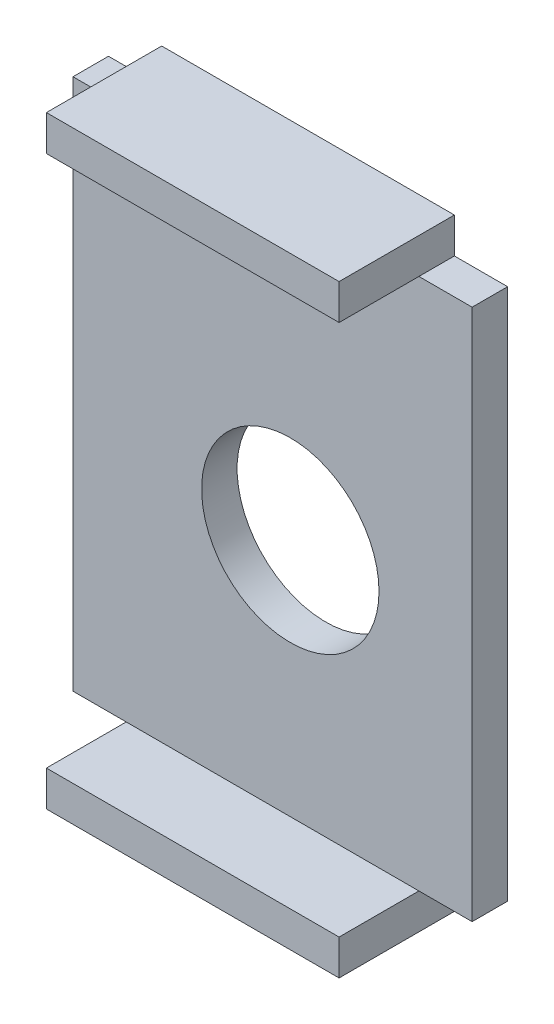
ISO-10303-21;
HEADER;
FILE_DESCRIPTION(('STEP AP214'),'2;1');
FILE_NAME('part.step','',(''),(''),'','','');
FILE_SCHEMA(('AUTOMOTIVE_DESIGN { 1 0 10303 214 1 1 1 1 }'));
ENDSEC;
DATA;
#1=APPLICATION_CONTEXT('core data for automotive mechanical design processes');
#2=APPLICATION_PROTOCOL_DEFINITION('international standard','automotive_design',2000,#1);
#3=PRODUCT_CONTEXT('',#1,'mechanical');
#4=PRODUCT('Part','Part','',(#3));
#5=PRODUCT_RELATED_PRODUCT_CATEGORY('part','',(#4));
#6=PRODUCT_DEFINITION_FORMATION('','',#4);
#7=PRODUCT_DEFINITION_CONTEXT('part definition',#1,'design');
#8=PRODUCT_DEFINITION('design','',#6,#7);
#9=PRODUCT_DEFINITION_SHAPE('','',#8);
#10=(LENGTH_UNIT() NAMED_UNIT(*) SI_UNIT(.MILLI.,.METRE.));
#11=(NAMED_UNIT(*) PLANE_ANGLE_UNIT() SI_UNIT($,.RADIAN.));
#12=(NAMED_UNIT(*) SI_UNIT($,.STERADIAN.) SOLID_ANGLE_UNIT());
#13=UNCERTAINTY_MEASURE_WITH_UNIT(LENGTH_MEASURE(1.E-05),#10,'distance_accuracy_value','');
#14=(GEOMETRIC_REPRESENTATION_CONTEXT(3) GLOBAL_UNCERTAINTY_ASSIGNED_CONTEXT((#13)) GLOBAL_UNIT_ASSIGNED_CONTEXT((#10,
#11,#12)) REPRESENTATION_CONTEXT('',''));
#15=CARTESIAN_POINT('',(0.,0.,0.));
#16=DIRECTION('',(0.,0.,1.));
#17=DIRECTION('',(1.,0.,0.));
#18=AXIS2_PLACEMENT_3D('',#15,#16,#17);
#19=CARTESIAN_POINT('',(-22.5,-30.,2.));
#20=DIRECTION('',(0.,1.,0.));
#21=DIRECTION('',(0.,0.,1.));
#22=AXIS2_PLACEMENT_3D('',#19,#20,#21);
#23=PLANE('',#22);
#24=DIRECTION('',(0.,0.,-1.));
#25=VECTOR('',#24,1.);
#26=CARTESIAN_POINT('',(-16.5,-30.,11.));
#27=LINE('',#26,#25);
#28=CARTESIAN_POINT('',(-16.5,-30.,2.00000000000001));
#29=VERTEX_POINT('',#28);
#30=CARTESIAN_POINT('',(-16.5,-30.,-2.));
#31=VERTEX_POINT('',#30);
#32=EDGE_CURVE('E11',#29,#31,#27,.T.);
#33=ORIENTED_EDGE('',*,*,#32,.F.);
#34=DIRECTION('',(1.,0.,0.));
#35=VECTOR('',#34,1.);
#36=CARTESIAN_POINT('',(-22.5,-30.,2.));
#37=LINE('',#36,#35);
#38=CARTESIAN_POINT('',(-22.5,-30.,2.));
#39=VERTEX_POINT('',#38);
#40=EDGE_CURVE('E221',#39,#29,#37,.T.);
#41=ORIENTED_EDGE('',*,*,#40,.F.);
#42=DIRECTION('',(0.,0.,-1.));
#43=VECTOR('',#42,1.);
#44=CARTESIAN_POINT('',(-22.5,-30.,2.));
#45=LINE('',#44,#43);
#46=CARTESIAN_POINT('',(-22.5,-30.,-2.));
#47=VERTEX_POINT('',#46);
#48=EDGE_CURVE('E239',#39,#47,#45,.T.);
#49=ORIENTED_EDGE('',*,*,#48,.T.);
#50=DIRECTION('',(1.,0.,0.));
#51=VECTOR('',#50,1.);
#52=CARTESIAN_POINT('',(-22.5,-30.,-2.));
#53=LINE('',#52,#51);
#54=EDGE_CURVE('E213',#47,#31,#53,.T.);
#55=ORIENTED_EDGE('',*,*,#54,.T.);
#56=EDGE_LOOP('',(#33,#41,#49,#55));
#57=FACE_BOUND('',#56,.T.);
#58=ADVANCED_FACE('F33',(#57),#23,.F.);
#59=CARTESIAN_POINT('',(-22.5,30.,2.));
#60=DIRECTION('',(0.,-1.,0.));
#61=DIRECTION('',(0.,0.,-1.));
#62=AXIS2_PLACEMENT_3D('',#59,#60,#61);
#63=PLANE('',#62);
#64=DIRECTION('',(0.,0.,-1.));
#65=VECTOR('',#64,1.);
#66=CARTESIAN_POINT('',(16.5,30.,11.));
#67=LINE('',#66,#65);
#68=CARTESIAN_POINT('',(16.5,30.,2.00000000000001));
#69=VERTEX_POINT('',#68);
#70=CARTESIAN_POINT('',(16.5,30.,-2.));
#71=VERTEX_POINT('',#70);
#72=EDGE_CURVE('E202',#69,#71,#67,.T.);
#73=ORIENTED_EDGE('',*,*,#72,.F.);
#74=DIRECTION('',(-1.,0.,0.));
#75=VECTOR('',#74,1.);
#76=CARTESIAN_POINT('',(-22.5,30.,2.));
#77=LINE('',#76,#75);
#78=CARTESIAN_POINT('',(22.5,30.,2.));
#79=VERTEX_POINT('',#78);
#80=EDGE_CURVE('E214',#79,#69,#77,.T.);
#81=ORIENTED_EDGE('',*,*,#80,.F.);
#82=DIRECTION('',(0.,0.,-1.));
#83=VECTOR('',#82,1.);
#84=CARTESIAN_POINT('',(22.5,30.,2.));
#85=LINE('',#84,#83);
#86=CARTESIAN_POINT('',(22.5,30.,-2.));
#87=VERTEX_POINT('',#86);
#88=EDGE_CURVE('E37',#79,#87,#85,.T.);
#89=ORIENTED_EDGE('',*,*,#88,.T.);
#90=DIRECTION('',(-1.,0.,0.));
#91=VECTOR('',#90,1.);
#92=CARTESIAN_POINT('',(-22.5,30.,-2.));
#93=LINE('',#92,#91);
#94=EDGE_CURVE('E229',#87,#71,#93,.T.);
#95=ORIENTED_EDGE('',*,*,#94,.T.);
#96=EDGE_LOOP('',(#73,#81,#89,#95));
#97=FACE_BOUND('',#96,.T.);
#98=ADVANCED_FACE('F285',(#97),#63,.F.);
#99=CARTESIAN_POINT('',(0.,0.,2.));
#100=DIRECTION('',(0.,0.,-1.));
#101=DIRECTION('',(-1.,0.,0.));
#102=AXIS2_PLACEMENT_3D('',#99,#100,#101);
#103=PLANE('',#102);
#104=DIRECTION('',(0.,1.,0.));
#105=VECTOR('',#104,1.);
#106=CARTESIAN_POINT('',(22.5,-30.,2.));
#107=LINE('',#106,#105);
#108=CARTESIAN_POINT('',(22.5,-30.,2.));
#109=VERTEX_POINT('',#108);
#110=EDGE_CURVE('E209',#109,#79,#107,.T.);
#111=ORIENTED_EDGE('',*,*,#110,.T.);
#112=ORIENTED_EDGE('',*,*,#80,.T.);
#113=CARTESIAN_POINT('',(-16.5,30.,2.00000000000001));
#114=VERTEX_POINT('',#113);
#115=EDGE_CURVE('E218',#69,#114,#77,.T.);
#116=ORIENTED_EDGE('',*,*,#115,.T.);
#117=CARTESIAN_POINT('',(-22.5,30.,2.));
#118=VERTEX_POINT('',#117);
#119=EDGE_CURVE('E212',#114,#118,#77,.T.);
#120=ORIENTED_EDGE('',*,*,#119,.T.);
#121=DIRECTION('',(0.,-1.,0.));
#122=VECTOR('',#121,1.);
#123=CARTESIAN_POINT('',(-22.5,-30.,2.));
#124=LINE('',#123,#122);
#125=EDGE_CURVE('E217',#118,#39,#124,.T.);
#126=ORIENTED_EDGE('',*,*,#125,.T.);
#127=ORIENTED_EDGE('',*,*,#40,.T.);
#128=CARTESIAN_POINT('',(16.5,-30.,2.00000000000001));
#129=VERTEX_POINT('',#128);
#130=EDGE_CURVE('E225',#29,#129,#37,.T.);
#131=ORIENTED_EDGE('',*,*,#130,.T.);
#132=EDGE_CURVE('E220',#129,#109,#37,.T.);
#133=ORIENTED_EDGE('',*,*,#132,.T.);
#134=EDGE_LOOP('',(#111,#112,#116,#120,#126,#127,#131,#133));
#135=FACE_BOUND('',#134,.T.);
#136=CARTESIAN_POINT('',(2.,-3.,2.));
#137=DIRECTION('',(0.,0.,1.));
#138=DIRECTION('',(1.,0.,0.));
#139=AXIS2_PLACEMENT_3D('',#136,#137,#138);
#140=CIRCLE('',#139,10.);
#141=CARTESIAN_POINT('',(12.,-3.,2.));
#142=VERTEX_POINT('',#141);
#143=EDGE_CURVE('E203',#142,#142,#140,.T.);
#144=ORIENTED_EDGE('',*,*,#143,.F.);
#145=EDGE_LOOP('',(#144));
#146=FACE_BOUND('',#145,.T.);
#147=ADVANCED_FACE('F269',(#135,#146),#103,.F.);
#148=CARTESIAN_POINT('',(0.,0.,-2.));
#149=DIRECTION('',(0.,0.,-1.));
#150=DIRECTION('',(-1.,0.,0.));
#151=AXIS2_PLACEMENT_3D('',#148,#149,#150);
#152=PLANE('',#151);
#153=DIRECTION('',(0.,1.,0.));
#154=VECTOR('',#153,1.);
#155=CARTESIAN_POINT('',(22.5,-30.,-2.));
#156=LINE('',#155,#154);
#157=CARTESIAN_POINT('',(22.5,-30.,-2.));
#158=VERTEX_POINT('',#157);
#159=EDGE_CURVE('E206',#158,#87,#156,.T.);
#160=ORIENTED_EDGE('',*,*,#159,.F.);
#161=CARTESIAN_POINT('',(16.5,-30.,-2.));
#162=VERTEX_POINT('',#161);
#163=EDGE_CURVE('E234',#162,#158,#53,.T.);
#164=ORIENTED_EDGE('',*,*,#163,.F.);
#165=DIRECTION('',(0.,-1.,0.));
#166=VECTOR('',#165,1.);
#167=CARTESIAN_POINT('',(16.5,-30.,-2.));
#168=LINE('',#167,#166);
#169=CARTESIAN_POINT('',(16.5,-34.,-2.));
#170=VERTEX_POINT('',#169);
#171=EDGE_CURVE('E51',#162,#170,#168,.T.);
#172=ORIENTED_EDGE('',*,*,#171,.T.);
#173=DIRECTION('',(-1.,0.,0.));
#174=VECTOR('',#173,1.);
#175=CARTESIAN_POINT('',(16.5,-34.,-2.));
#176=LINE('',#175,#174);
#177=CARTESIAN_POINT('',(-16.5,-34.,-2.));
#178=VERTEX_POINT('',#177);
#179=EDGE_CURVE('E141',#170,#178,#176,.T.);
#180=ORIENTED_EDGE('',*,*,#179,.T.);
#181=DIRECTION('',(0.,1.,0.));
#182=VECTOR('',#181,1.);
#183=CARTESIAN_POINT('',(-16.5,-30.,-2.));
#184=LINE('',#183,#182);
#185=EDGE_CURVE('E159',#178,#31,#184,.T.);
#186=ORIENTED_EDGE('',*,*,#185,.T.);
#187=ORIENTED_EDGE('',*,*,#54,.F.);
#188=DIRECTION('',(0.,-1.,0.));
#189=VECTOR('',#188,1.);
#190=CARTESIAN_POINT('',(-22.5,-30.,-2.));
#191=LINE('',#190,#189);
#192=CARTESIAN_POINT('',(-22.5,30.,-2.));
#193=VERTEX_POINT('',#192);
#194=EDGE_CURVE('E232',#193,#47,#191,.T.);
#195=ORIENTED_EDGE('',*,*,#194,.F.);
#196=CARTESIAN_POINT('',(-16.5,30.,-2.));
#197=VERTEX_POINT('',#196);
#198=EDGE_CURVE('E228',#197,#193,#93,.T.);
#199=ORIENTED_EDGE('',*,*,#198,.F.);
#200=DIRECTION('',(0.,1.,0.));
#201=VECTOR('',#200,1.);
#202=CARTESIAN_POINT('',(-16.5,30.,-2.));
#203=LINE('',#202,#201);
#204=CARTESIAN_POINT('',(-16.5,34.,-2.));
#205=VERTEX_POINT('',#204);
#206=EDGE_CURVE('E59',#197,#205,#203,.T.);
#207=ORIENTED_EDGE('',*,*,#206,.T.);
#208=DIRECTION('',(1.,0.,0.));
#209=VECTOR('',#208,1.);
#210=CARTESIAN_POINT('',(16.5,34.,-2.));
#211=LINE('',#210,#209);
#212=CARTESIAN_POINT('',(16.5,34.,-2.));
#213=VERTEX_POINT('',#212);
#214=EDGE_CURVE('E176',#205,#213,#211,.T.);
#215=ORIENTED_EDGE('',*,*,#214,.T.);
#216=DIRECTION('',(0.,-1.,0.));
#217=VECTOR('',#216,1.);
#218=CARTESIAN_POINT('',(16.5,30.,-2.));
#219=LINE('',#218,#217);
#220=EDGE_CURVE('E168',#213,#71,#219,.T.);
#221=ORIENTED_EDGE('',*,*,#220,.T.);
#222=ORIENTED_EDGE('',*,*,#94,.F.);
#223=EDGE_LOOP('',(#160,#164,#172,#180,#186,#187,#195,#199,#207,#215,#221,#222));
#224=FACE_BOUND('',#223,.T.);
#225=CARTESIAN_POINT('',(2.,-3.,-2.));
#226=DIRECTION('',(0.,0.,1.));
#227=DIRECTION('',(1.,0.,0.));
#228=AXIS2_PLACEMENT_3D('',#225,#226,#227);
#229=CIRCLE('',#228,10.);
#230=CARTESIAN_POINT('',(12.,-3.,-2.));
#231=VERTEX_POINT('',#230);
#232=EDGE_CURVE('E193',#231,#231,#229,.T.);
#233=ORIENTED_EDGE('',*,*,#232,.T.);
#234=EDGE_LOOP('',(#233));
#235=FACE_BOUND('',#234,.T.);
#236=ADVANCED_FACE('F264',(#224,#235),#152,.T.);
#237=CARTESIAN_POINT('',(22.5,-30.,2.));
#238=DIRECTION('',(-1.,0.,0.));
#239=DIRECTION('',(0.,0.,1.));
#240=AXIS2_PLACEMENT_3D('',#237,#238,#239);
#241=PLANE('',#240);
#242=ORIENTED_EDGE('',*,*,#159,.T.);
#243=ORIENTED_EDGE('',*,*,#88,.F.);
#244=ORIENTED_EDGE('',*,*,#110,.F.);
#245=DIRECTION('',(0.,0.,-1.));
#246=VECTOR('',#245,1.);
#247=CARTESIAN_POINT('',(22.5,-30.,2.));
#248=LINE('',#247,#246);
#249=EDGE_CURVE('E224',#109,#158,#248,.T.);
#250=ORIENTED_EDGE('',*,*,#249,.T.);
#251=EDGE_LOOP('',(#242,#243,#244,#250));
#252=FACE_BOUND('',#251,.T.);
#253=ADVANCED_FACE('F35',(#252),#241,.F.);
#254=ORIENTED_EDGE('',*,*,#119,.F.);
#255=DIRECTION('',(0.,0.,-1.));
#256=VECTOR('',#255,1.);
#257=CARTESIAN_POINT('',(-16.5,30.,11.));
#258=LINE('',#257,#256);
#259=EDGE_CURVE('E199',#114,#197,#258,.T.);
#260=ORIENTED_EDGE('',*,*,#259,.T.);
#261=ORIENTED_EDGE('',*,*,#198,.T.);
#262=DIRECTION('',(0.,0.,-1.));
#263=VECTOR('',#262,1.);
#264=CARTESIAN_POINT('',(-22.5,30.,2.));
#265=LINE('',#264,#263);
#266=EDGE_CURVE('E241',#118,#193,#265,.T.);
#267=ORIENTED_EDGE('',*,*,#266,.F.);
#268=EDGE_LOOP('',(#254,#260,#261,#267));
#269=FACE_BOUND('',#268,.T.);
#270=ADVANCED_FACE('F283',(#269),#63,.F.);
#271=CARTESIAN_POINT('',(-22.5,-30.,2.));
#272=DIRECTION('',(1.,0.,0.));
#273=DIRECTION('',(0.,0.,-1.));
#274=AXIS2_PLACEMENT_3D('',#271,#272,#273);
#275=PLANE('',#274);
#276=ORIENTED_EDGE('',*,*,#194,.T.);
#277=ORIENTED_EDGE('',*,*,#48,.F.);
#278=ORIENTED_EDGE('',*,*,#125,.F.);
#279=ORIENTED_EDGE('',*,*,#266,.T.);
#280=EDGE_LOOP('',(#276,#277,#278,#279));
#281=FACE_BOUND('',#280,.T.);
#282=ADVANCED_FACE('F282',(#281),#275,.F.);
#283=ORIENTED_EDGE('',*,*,#132,.F.);
#284=DIRECTION('',(0.,0.,-1.));
#285=VECTOR('',#284,1.);
#286=CARTESIAN_POINT('',(16.5,-30.,11.));
#287=LINE('',#286,#285);
#288=EDGE_CURVE('E42',#129,#162,#287,.T.);
#289=ORIENTED_EDGE('',*,*,#288,.T.);
#290=ORIENTED_EDGE('',*,*,#163,.T.);
#291=ORIENTED_EDGE('',*,*,#249,.F.);
#292=EDGE_LOOP('',(#283,#289,#290,#291));
#293=FACE_BOUND('',#292,.T.);
#294=ADVANCED_FACE('F259',(#293),#23,.F.);
#295=CARTESIAN_POINT('',(2.,-3.,2.));
#296=DIRECTION('',(0.,0.,-1.));
#297=DIRECTION('',(-1.,0.,0.));
#298=AXIS2_PLACEMENT_3D('',#295,#296,#297);
#299=CYLINDRICAL_SURFACE('',#298,10.);
#300=ORIENTED_EDGE('',*,*,#143,.T.);
#301=EDGE_LOOP('',(#300));
#302=FACE_BOUND('',#301,.T.);
#303=ORIENTED_EDGE('',*,*,#232,.F.);
#304=EDGE_LOOP('',(#303));
#305=FACE_BOUND('',#304,.T.);
#306=ADVANCED_FACE('F298',(#302,#305),#299,.F.);
#307=CARTESIAN_POINT('',(16.5,30.,11.));
#308=DIRECTION('',(0.,-1.,0.));
#309=DIRECTION('',(0.,0.,-1.));
#310=AXIS2_PLACEMENT_3D('',#307,#308,#309);
#311=PLANE('',#310);
#312=ORIENTED_EDGE('',*,*,#115,.F.);
#313=CARTESIAN_POINT('',(16.5,30.,11.));
#314=VERTEX_POINT('',#313);
#315=EDGE_CURVE('E185',#314,#69,#67,.T.);
#316=ORIENTED_EDGE('',*,*,#315,.F.);
#317=DIRECTION('',(-1.,0.,0.));
#318=VECTOR('',#317,1.);
#319=CARTESIAN_POINT('',(16.5,30.,11.));
#320=LINE('',#319,#318);
#321=CARTESIAN_POINT('',(-16.5,30.,11.));
#322=VERTEX_POINT('',#321);
#323=EDGE_CURVE('E175',#314,#322,#320,.T.);
#324=ORIENTED_EDGE('',*,*,#323,.T.);
#325=EDGE_CURVE('E196',#322,#114,#258,.T.);
#326=ORIENTED_EDGE('',*,*,#325,.T.);
#327=EDGE_LOOP('',(#312,#316,#324,#326));
#328=FACE_BOUND('',#327,.T.);
#329=ADVANCED_FACE('F302',(#328),#311,.T.);
#330=CARTESIAN_POINT('',(16.5,30.,11.));
#331=DIRECTION('',(1.,0.,0.));
#332=DIRECTION('',(0.,0.,-1.));
#333=AXIS2_PLACEMENT_3D('',#330,#331,#332);
#334=PLANE('',#333);
#335=ORIENTED_EDGE('',*,*,#220,.F.);
#336=DIRECTION('',(0.,0.,-1.));
#337=VECTOR('',#336,1.);
#338=CARTESIAN_POINT('',(16.5,34.,11.));
#339=LINE('',#338,#337);
#340=CARTESIAN_POINT('',(16.5,34.,11.));
#341=VERTEX_POINT('',#340);
#342=EDGE_CURVE('E191',#341,#213,#339,.T.);
#343=ORIENTED_EDGE('',*,*,#342,.F.);
#344=DIRECTION('',(0.,-1.,0.));
#345=VECTOR('',#344,1.);
#346=CARTESIAN_POINT('',(16.5,30.,11.));
#347=LINE('',#346,#345);
#348=EDGE_CURVE('E172',#341,#314,#347,.T.);
#349=ORIENTED_EDGE('',*,*,#348,.T.);
#350=ORIENTED_EDGE('',*,*,#315,.T.);
#351=ORIENTED_EDGE('',*,*,#72,.T.);
#352=EDGE_LOOP('',(#335,#343,#349,#350,#351));
#353=FACE_BOUND('',#352,.T.);
#354=ADVANCED_FACE('F308',(#353),#334,.T.);
#355=CARTESIAN_POINT('',(16.5,34.,11.));
#356=DIRECTION('',(0.,1.,0.));
#357=DIRECTION('',(0.,0.,1.));
#358=AXIS2_PLACEMENT_3D('',#355,#356,#357);
#359=PLANE('',#358);
#360=ORIENTED_EDGE('',*,*,#214,.F.);
#361=DIRECTION('',(0.,0.,-1.));
#362=VECTOR('',#361,1.);
#363=CARTESIAN_POINT('',(-16.5,34.,11.));
#364=LINE('',#363,#362);
#365=CARTESIAN_POINT('',(-16.5,34.,11.));
#366=VERTEX_POINT('',#365);
#367=EDGE_CURVE('E194',#366,#205,#364,.T.);
#368=ORIENTED_EDGE('',*,*,#367,.F.);
#369=DIRECTION('',(1.,0.,0.));
#370=VECTOR('',#369,1.);
#371=CARTESIAN_POINT('',(16.5,34.,11.));
#372=LINE('',#371,#370);
#373=EDGE_CURVE('E182',#366,#341,#372,.T.);
#374=ORIENTED_EDGE('',*,*,#373,.T.);
#375=ORIENTED_EDGE('',*,*,#342,.T.);
#376=EDGE_LOOP('',(#360,#368,#374,#375));
#377=FACE_BOUND('',#376,.T.);
#378=ADVANCED_FACE('F373',(#377),#359,.T.);
#379=CARTESIAN_POINT('',(-16.5,30.,11.));
#380=DIRECTION('',(-1.,0.,0.));
#381=DIRECTION('',(0.,0.,1.));
#382=AXIS2_PLACEMENT_3D('',#379,#380,#381);
#383=PLANE('',#382);
#384=ORIENTED_EDGE('',*,*,#206,.F.);
#385=ORIENTED_EDGE('',*,*,#259,.F.);
#386=ORIENTED_EDGE('',*,*,#325,.F.);
#387=DIRECTION('',(0.,1.,0.));
#388=VECTOR('',#387,1.);
#389=CARTESIAN_POINT('',(-16.5,30.,11.));
#390=LINE('',#389,#388);
#391=EDGE_CURVE('E179',#322,#366,#390,.T.);
#392=ORIENTED_EDGE('',*,*,#391,.T.);
#393=ORIENTED_EDGE('',*,*,#367,.T.);
#394=EDGE_LOOP('',(#384,#385,#386,#392,#393));
#395=FACE_BOUND('',#394,.T.);
#396=ADVANCED_FACE('F380',(#395),#383,.T.);
#397=CARTESIAN_POINT('',(0.,0.,11.));
#398=DIRECTION('',(0.,0.,1.));
#399=DIRECTION('',(1.,0.,0.));
#400=AXIS2_PLACEMENT_3D('',#397,#398,#399);
#401=PLANE('',#400);
#402=ORIENTED_EDGE('',*,*,#348,.F.);
#403=ORIENTED_EDGE('',*,*,#373,.F.);
#404=ORIENTED_EDGE('',*,*,#391,.F.);
#405=ORIENTED_EDGE('',*,*,#323,.F.);
#406=EDGE_LOOP('',(#402,#403,#404,#405));
#407=FACE_BOUND('',#406,.T.);
#408=ADVANCED_FACE('F389',(#407),#401,.T.);
#409=CARTESIAN_POINT('',(16.5,-30.,11.));
#410=DIRECTION('',(0.,1.,0.));
#411=DIRECTION('',(0.,0.,1.));
#412=AXIS2_PLACEMENT_3D('',#409,#410,#411);
#413=PLANE('',#412);
#414=ORIENTED_EDGE('',*,*,#130,.F.);
#415=CARTESIAN_POINT('',(-16.5,-30.,11.));
#416=VERTEX_POINT('',#415);
#417=EDGE_CURVE('E44',#416,#29,#27,.T.);
#418=ORIENTED_EDGE('',*,*,#417,.F.);
#419=DIRECTION('',(1.,0.,0.));
#420=VECTOR('',#419,1.);
#421=CARTESIAN_POINT('',(16.5,-30.,11.));
#422=LINE('',#421,#420);
#423=CARTESIAN_POINT('',(16.5,-30.,11.));
#424=VERTEX_POINT('',#423);
#425=EDGE_CURVE('E144',#416,#424,#422,.T.);
#426=ORIENTED_EDGE('',*,*,#425,.T.);
#427=EDGE_CURVE('E158',#424,#129,#287,.T.);
#428=ORIENTED_EDGE('',*,*,#427,.T.);
#429=EDGE_LOOP('',(#414,#418,#426,#428));
#430=FACE_BOUND('',#429,.T.);
#431=ADVANCED_FACE('F274',(#430),#413,.T.);
#432=CARTESIAN_POINT('',(16.5,-30.,11.));
#433=DIRECTION('',(1.,0.,0.));
#434=DIRECTION('',(0.,0.,-1.));
#435=AXIS2_PLACEMENT_3D('',#432,#433,#434);
#436=PLANE('',#435);
#437=ORIENTED_EDGE('',*,*,#171,.F.);
#438=ORIENTED_EDGE('',*,*,#288,.F.);
#439=ORIENTED_EDGE('',*,*,#427,.F.);
#440=DIRECTION('',(0.,-1.,0.));
#441=VECTOR('',#440,1.);
#442=CARTESIAN_POINT('',(16.5,-30.,11.));
#443=LINE('',#442,#441);
#444=CARTESIAN_POINT('',(16.5,-34.,11.));
#445=VERTEX_POINT('',#444);
#446=EDGE_CURVE('E151',#424,#445,#443,.T.);
#447=ORIENTED_EDGE('',*,*,#446,.T.);
#448=DIRECTION('',(0.,0.,-1.));
#449=VECTOR('',#448,1.);
#450=CARTESIAN_POINT('',(16.5,-34.,11.));
#451=LINE('',#450,#449);
#452=EDGE_CURVE('E136',#445,#170,#451,.T.);
#453=ORIENTED_EDGE('',*,*,#452,.T.);
#454=EDGE_LOOP('',(#437,#438,#439,#447,#453));
#455=FACE_BOUND('',#454,.T.);
#456=ADVANCED_FACE('F156',(#455),#436,.T.);
#457=CARTESIAN_POINT('',(-16.5,-30.,11.));
#458=DIRECTION('',(-1.,0.,0.));
#459=DIRECTION('',(0.,0.,1.));
#460=AXIS2_PLACEMENT_3D('',#457,#458,#459);
#461=PLANE('',#460);
#462=ORIENTED_EDGE('',*,*,#185,.F.);
#463=DIRECTION('',(0.,0.,-1.));
#464=VECTOR('',#463,1.);
#465=CARTESIAN_POINT('',(-16.5,-34.,11.));
#466=LINE('',#465,#464);
#467=CARTESIAN_POINT('',(-16.5,-34.,11.));
#468=VERTEX_POINT('',#467);
#469=EDGE_CURVE('E143',#468,#178,#466,.T.);
#470=ORIENTED_EDGE('',*,*,#469,.F.);
#471=DIRECTION('',(0.,1.,0.));
#472=VECTOR('',#471,1.);
#473=CARTESIAN_POINT('',(-16.5,-30.,11.));
#474=LINE('',#473,#472);
#475=EDGE_CURVE('E154',#468,#416,#474,.T.);
#476=ORIENTED_EDGE('',*,*,#475,.T.);
#477=ORIENTED_EDGE('',*,*,#417,.T.);
#478=ORIENTED_EDGE('',*,*,#32,.T.);
#479=EDGE_LOOP('',(#462,#470,#476,#477,#478));
#480=FACE_BOUND('',#479,.T.);
#481=ADVANCED_FACE('F278',(#480),#461,.T.);
#482=CARTESIAN_POINT('',(16.5,-34.,11.));
#483=DIRECTION('',(0.,-1.,0.));
#484=DIRECTION('',(0.,0.,-1.));
#485=AXIS2_PLACEMENT_3D('',#482,#483,#484);
#486=PLANE('',#485);
#487=ORIENTED_EDGE('',*,*,#179,.F.);
#488=ORIENTED_EDGE('',*,*,#452,.F.);
#489=DIRECTION('',(-1.,0.,0.));
#490=VECTOR('',#489,1.);
#491=CARTESIAN_POINT('',(16.5,-34.,11.));
#492=LINE('',#491,#490);
#493=EDGE_CURVE('E139',#445,#468,#492,.T.);
#494=ORIENTED_EDGE('',*,*,#493,.T.);
#495=ORIENTED_EDGE('',*,*,#469,.T.);
#496=EDGE_LOOP('',(#487,#488,#494,#495));
#497=FACE_BOUND('',#496,.T.);
#498=ADVANCED_FACE('F138',(#497),#486,.T.);
#499=CARTESIAN_POINT('',(0.,0.,11.));
#500=DIRECTION('',(0.,0.,-1.));
#501=DIRECTION('',(-1.,0.,0.));
#502=AXIS2_PLACEMENT_3D('',#499,#500,#501);
#503=PLANE('',#502);
#504=ORIENTED_EDGE('',*,*,#446,.F.);
#505=ORIENTED_EDGE('',*,*,#425,.F.);
#506=ORIENTED_EDGE('',*,*,#475,.F.);
#507=ORIENTED_EDGE('',*,*,#493,.F.);
#508=EDGE_LOOP('',(#504,#505,#506,#507));
#509=FACE_BOUND('',#508,.T.);
#510=ADVANCED_FACE('F149',(#509),#503,.F.);
#511=CLOSED_SHELL('',(#58,#98,#147,#236,#253,#270,#282,#294,#306,#329,#354,#378,#396,#408,#431,
#456,#481,#498,#510));
#512=MANIFOLD_SOLID_BREP('B2',#511);
#513=ADVANCED_BREP_SHAPE_REPRESENTATION('',(#18,#512),#14);
#514=SHAPE_DEFINITION_REPRESENTATION(#9,#513);
ENDSEC;
END-ISO-10303-21;
